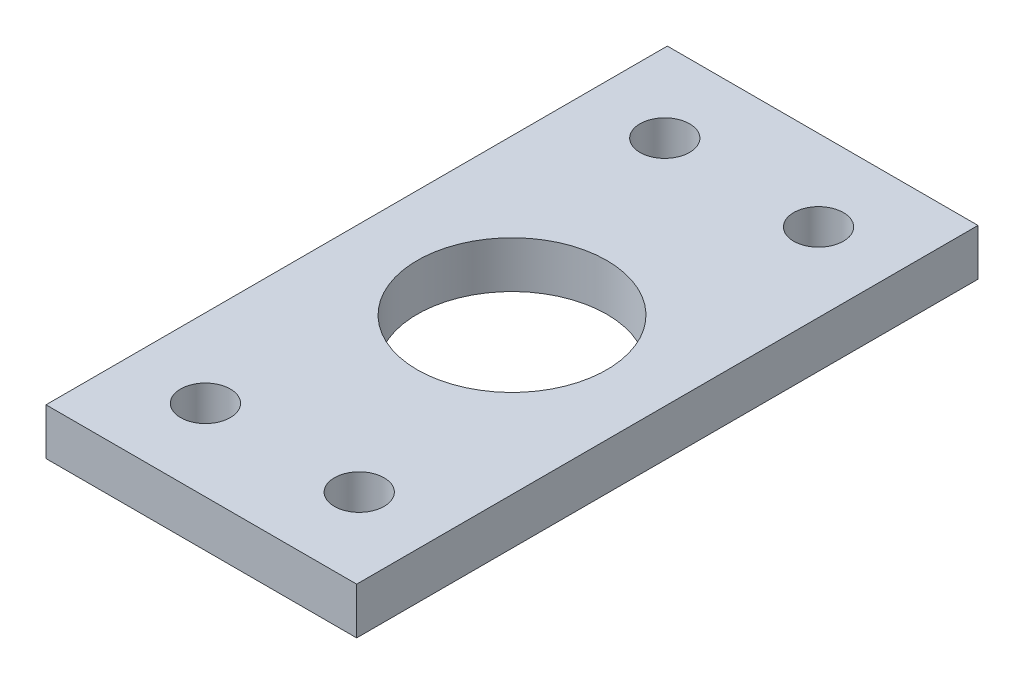
ISO-10303-21;
HEADER;
FILE_DESCRIPTION(('STEP AP214'),'2;1');
FILE_NAME('part.step','',(''),(''),'','','');
FILE_SCHEMA(('AUTOMOTIVE_DESIGN { 1 0 10303 214 1 1 1 1 }'));
ENDSEC;
DATA;
#1=APPLICATION_CONTEXT('core data for automotive mechanical design processes');
#2=APPLICATION_PROTOCOL_DEFINITION('international standard','automotive_design',2000,#1);
#3=PRODUCT_CONTEXT('',#1,'mechanical');
#4=PRODUCT('Part','Part','',(#3));
#5=PRODUCT_RELATED_PRODUCT_CATEGORY('part','',(#4));
#6=PRODUCT_DEFINITION_FORMATION('','',#4);
#7=PRODUCT_DEFINITION_CONTEXT('part definition',#1,'design');
#8=PRODUCT_DEFINITION('design','',#6,#7);
#9=PRODUCT_DEFINITION_SHAPE('','',#8);
#10=(LENGTH_UNIT() NAMED_UNIT(*) SI_UNIT(.MILLI.,.METRE.));
#11=(NAMED_UNIT(*) PLANE_ANGLE_UNIT() SI_UNIT($,.RADIAN.));
#12=(NAMED_UNIT(*) SI_UNIT($,.STERADIAN.) SOLID_ANGLE_UNIT());
#13=UNCERTAINTY_MEASURE_WITH_UNIT(LENGTH_MEASURE(1.E-05),#10,'distance_accuracy_value','');
#14=(GEOMETRIC_REPRESENTATION_CONTEXT(3) GLOBAL_UNCERTAINTY_ASSIGNED_CONTEXT((#13)) GLOBAL_UNIT_ASSIGNED_CONTEXT((#10,
#11,#12)) REPRESENTATION_CONTEXT('',''));
#15=CARTESIAN_POINT('',(0.,0.,0.));
#16=DIRECTION('',(0.,0.,1.));
#17=DIRECTION('',(1.,0.,0.));
#18=AXIS2_PLACEMENT_3D('',#15,#16,#17);
#19=CARTESIAN_POINT('',(0.,3.,0.));
#20=DIRECTION('',(0.,-1.,0.));
#21=DIRECTION('',(0.,0.,-1.));
#22=AXIS2_PLACEMENT_3D('',#19,#20,#21);
#23=PLANE('',#22);
#24=DIRECTION('',(0.,0.,-1.));
#25=VECTOR('',#24,1.);
#26=CARTESIAN_POINT('',(10.,3.,20.));
#27=LINE('',#26,#25);
#28=CARTESIAN_POINT('',(10.,3.,20.));
#29=VERTEX_POINT('',#28);
#30=CARTESIAN_POINT('',(10.,3.,-20.));
#31=VERTEX_POINT('',#30);
#32=EDGE_CURVE('E85',#29,#31,#27,.T.);
#33=ORIENTED_EDGE('',*,*,#32,.T.);
#34=DIRECTION('',(-1.,0.,0.));
#35=VECTOR('',#34,1.);
#36=CARTESIAN_POINT('',(-10.,3.,-20.));
#37=LINE('',#36,#35);
#38=CARTESIAN_POINT('',(-10.,3.,-20.));
#39=VERTEX_POINT('',#38);
#40=EDGE_CURVE('E80',#31,#39,#37,.T.);
#41=ORIENTED_EDGE('',*,*,#40,.T.);
#42=DIRECTION('',(0.,0.,1.));
#43=VECTOR('',#42,1.);
#44=CARTESIAN_POINT('',(-9.99999999999999,3.,20.));
#45=LINE('',#44,#43);
#46=CARTESIAN_POINT('',(-9.99999999999999,3.,20.));
#47=VERTEX_POINT('',#46);
#48=EDGE_CURVE('E83',#39,#47,#45,.T.);
#49=ORIENTED_EDGE('',*,*,#48,.T.);
#50=DIRECTION('',(1.,0.,0.));
#51=VECTOR('',#50,1.);
#52=CARTESIAN_POINT('',(-9.99999999999999,3.,20.));
#53=LINE('',#52,#51);
#54=EDGE_CURVE('E50',#47,#29,#53,.T.);
#55=ORIENTED_EDGE('',*,*,#54,.T.);
#56=EDGE_LOOP('',(#33,#41,#49,#55));
#57=FACE_BOUND('',#56,.T.);
#58=CARTESIAN_POINT('',(0.,3.,0.));
#59=DIRECTION('',(0.,1.,0.));
#60=DIRECTION('',(0.,0.,1.));
#61=AXIS2_PLACEMENT_3D('',#58,#59,#60);
#62=CIRCLE('',#61,6.1);
#63=CARTESIAN_POINT('',(0.,3.,6.1));
#64=VERTEX_POINT('',#63);
#65=EDGE_CURVE('E100',#64,#64,#62,.T.);
#66=ORIENTED_EDGE('',*,*,#65,.F.);
#67=EDGE_LOOP('',(#66));
#68=FACE_BOUND('',#67,.T.);
#69=CARTESIAN_POINT('',(4.95,3.,-14.785));
#70=DIRECTION('',(0.,1.,0.));
#71=DIRECTION('',(0.,0.,1.));
#72=AXIS2_PLACEMENT_3D('',#69,#70,#71);
#73=CIRCLE('',#72,1.6);
#74=CARTESIAN_POINT('',(4.95,3.,-13.185));
#75=VERTEX_POINT('',#74);
#76=EDGE_CURVE('E115',#75,#75,#73,.T.);
#77=ORIENTED_EDGE('',*,*,#76,.F.);
#78=EDGE_LOOP('',(#77));
#79=FACE_BOUND('',#78,.T.);
#80=CARTESIAN_POINT('',(4.95,3.,14.785));
#81=DIRECTION('',(0.,1.,0.));
#82=DIRECTION('',(0.,0.,-1.));
#83=AXIS2_PLACEMENT_3D('',#80,#81,#82);
#84=CIRCLE('',#83,1.6);
#85=CARTESIAN_POINT('',(4.95,3.,13.185));
#86=VERTEX_POINT('',#85);
#87=EDGE_CURVE('E121',#86,#86,#84,.T.);
#88=ORIENTED_EDGE('',*,*,#87,.F.);
#89=EDGE_LOOP('',(#88));
#90=FACE_BOUND('',#89,.T.);
#91=CARTESIAN_POINT('',(-4.95,3.,-14.785));
#92=DIRECTION('',(0.,1.,0.));
#93=DIRECTION('',(0.,0.,-1.));
#94=AXIS2_PLACEMENT_3D('',#91,#92,#93);
#95=CIRCLE('',#94,1.60000000000001);
#96=CARTESIAN_POINT('',(-4.95,3.,-16.385));
#97=VERTEX_POINT('',#96);
#98=EDGE_CURVE('E127',#97,#97,#95,.T.);
#99=ORIENTED_EDGE('',*,*,#98,.F.);
#100=EDGE_LOOP('',(#99));
#101=FACE_BOUND('',#100,.T.);
#102=CARTESIAN_POINT('',(-4.95,3.,14.785));
#103=DIRECTION('',(0.,1.,0.));
#104=DIRECTION('',(0.,0.,1.));
#105=AXIS2_PLACEMENT_3D('',#102,#103,#104);
#106=CIRCLE('',#105,1.60000000000001);
#107=CARTESIAN_POINT('',(-4.95,3.,16.385));
#108=VERTEX_POINT('',#107);
#109=EDGE_CURVE('E133',#108,#108,#106,.T.);
#110=ORIENTED_EDGE('',*,*,#109,.F.);
#111=EDGE_LOOP('',(#110));
#112=FACE_BOUND('',#111,.T.);
#113=ADVANCED_FACE('F33',(#57,#68,#79,#90,#101,#112),#23,.F.);
#114=CARTESIAN_POINT('',(0.,0.,0.));
#115=DIRECTION('',(0.,-1.,0.));
#116=DIRECTION('',(0.,0.,-1.));
#117=AXIS2_PLACEMENT_3D('',#114,#115,#116);
#118=PLANE('',#117);
#119=CARTESIAN_POINT('',(-4.95,0.,-14.785));
#120=DIRECTION('',(0.,1.,0.));
#121=DIRECTION('',(0.,0.,-1.));
#122=AXIS2_PLACEMENT_3D('',#119,#120,#121);
#123=CIRCLE('',#122,1.60000000000001);
#124=CARTESIAN_POINT('',(-4.95,0.,-16.385));
#125=VERTEX_POINT('',#124);
#126=EDGE_CURVE('E130',#125,#125,#123,.T.);
#127=ORIENTED_EDGE('',*,*,#126,.T.);
#128=EDGE_LOOP('',(#127));
#129=FACE_BOUND('',#128,.T.);
#130=CARTESIAN_POINT('',(4.95,0.,-14.785));
#131=DIRECTION('',(0.,1.,0.));
#132=DIRECTION('',(0.,0.,1.));
#133=AXIS2_PLACEMENT_3D('',#130,#131,#132);
#134=CIRCLE('',#133,1.6);
#135=CARTESIAN_POINT('',(4.95,0.,-13.185));
#136=VERTEX_POINT('',#135);
#137=EDGE_CURVE('E118',#136,#136,#134,.T.);
#138=ORIENTED_EDGE('',*,*,#137,.T.);
#139=EDGE_LOOP('',(#138));
#140=FACE_BOUND('',#139,.T.);
#141=DIRECTION('',(0.,0.,-1.));
#142=VECTOR('',#141,1.);
#143=CARTESIAN_POINT('',(10.,0.,20.));
#144=LINE('',#143,#142);
#145=CARTESIAN_POINT('',(10.,0.,20.));
#146=VERTEX_POINT('',#145);
#147=CARTESIAN_POINT('',(10.,0.,-20.));
#148=VERTEX_POINT('',#147);
#149=EDGE_CURVE('E97',#146,#148,#144,.T.);
#150=ORIENTED_EDGE('',*,*,#149,.F.);
#151=DIRECTION('',(1.,0.,0.));
#152=VECTOR('',#151,1.);
#153=CARTESIAN_POINT('',(-9.99999999999999,0.,20.));
#154=LINE('',#153,#152);
#155=CARTESIAN_POINT('',(-9.99999999999999,0.,20.));
#156=VERTEX_POINT('',#155);
#157=EDGE_CURVE('E73',#156,#146,#154,.T.);
#158=ORIENTED_EDGE('',*,*,#157,.F.);
#159=DIRECTION('',(0.,0.,1.));
#160=VECTOR('',#159,1.);
#161=CARTESIAN_POINT('',(-9.99999999999999,0.,20.));
#162=LINE('',#161,#160);
#163=CARTESIAN_POINT('',(-10.,0.,-20.));
#164=VERTEX_POINT('',#163);
#165=EDGE_CURVE('E67',#164,#156,#162,.T.);
#166=ORIENTED_EDGE('',*,*,#165,.F.);
#167=DIRECTION('',(-1.,0.,0.));
#168=VECTOR('',#167,1.);
#169=CARTESIAN_POINT('',(-10.,0.,-20.));
#170=LINE('',#169,#168);
#171=EDGE_CURVE('E89',#148,#164,#170,.T.);
#172=ORIENTED_EDGE('',*,*,#171,.F.);
#173=EDGE_LOOP('',(#150,#158,#166,#172));
#174=FACE_BOUND('',#173,.T.);
#175=CARTESIAN_POINT('',(0.,0.,0.));
#176=DIRECTION('',(0.,1.,0.));
#177=DIRECTION('',(0.,0.,1.));
#178=AXIS2_PLACEMENT_3D('',#175,#176,#177);
#179=CIRCLE('',#178,6.1);
#180=CARTESIAN_POINT('',(0.,0.,6.1));
#181=VERTEX_POINT('',#180);
#182=EDGE_CURVE('E112',#181,#181,#179,.T.);
#183=ORIENTED_EDGE('',*,*,#182,.T.);
#184=EDGE_LOOP('',(#183));
#185=FACE_BOUND('',#184,.T.);
#186=CARTESIAN_POINT('',(4.95,0.,14.785));
#187=DIRECTION('',(0.,1.,0.));
#188=DIRECTION('',(0.,0.,-1.));
#189=AXIS2_PLACEMENT_3D('',#186,#187,#188);
#190=CIRCLE('',#189,1.6);
#191=CARTESIAN_POINT('',(4.95,0.,13.185));
#192=VERTEX_POINT('',#191);
#193=EDGE_CURVE('E124',#192,#192,#190,.T.);
#194=ORIENTED_EDGE('',*,*,#193,.T.);
#195=EDGE_LOOP('',(#194));
#196=FACE_BOUND('',#195,.T.);
#197=CARTESIAN_POINT('',(-4.95,0.,14.785));
#198=DIRECTION('',(0.,1.,0.));
#199=DIRECTION('',(0.,0.,1.));
#200=AXIS2_PLACEMENT_3D('',#197,#198,#199);
#201=CIRCLE('',#200,1.60000000000001);
#202=CARTESIAN_POINT('',(-4.95,0.,16.385));
#203=VERTEX_POINT('',#202);
#204=EDGE_CURVE('E136',#203,#203,#201,.T.);
#205=ORIENTED_EDGE('',*,*,#204,.T.);
#206=EDGE_LOOP('',(#205));
#207=FACE_BOUND('',#206,.T.);
#208=ADVANCED_FACE('F108',(#129,#140,#174,#185,#196,#207),#118,.T.);
#209=CARTESIAN_POINT('',(10.,3.,20.));
#210=DIRECTION('',(-1.,0.,0.));
#211=DIRECTION('',(0.,0.,1.));
#212=AXIS2_PLACEMENT_3D('',#209,#210,#211);
#213=PLANE('',#212);
#214=ORIENTED_EDGE('',*,*,#149,.T.);
#215=DIRECTION('',(0.,-1.,0.));
#216=VECTOR('',#215,1.);
#217=CARTESIAN_POINT('',(10.,3.,-20.));
#218=LINE('',#217,#216);
#219=EDGE_CURVE('E11',#31,#148,#218,.T.);
#220=ORIENTED_EDGE('',*,*,#219,.F.);
#221=ORIENTED_EDGE('',*,*,#32,.F.);
#222=DIRECTION('',(0.,-1.,0.));
#223=VECTOR('',#222,1.);
#224=CARTESIAN_POINT('',(10.,3.,20.));
#225=LINE('',#224,#223);
#226=EDGE_CURVE('E93',#29,#146,#225,.T.);
#227=ORIENTED_EDGE('',*,*,#226,.T.);
#228=EDGE_LOOP('',(#214,#220,#221,#227));
#229=FACE_BOUND('',#228,.T.);
#230=ADVANCED_FACE('F35',(#229),#213,.F.);
#231=CARTESIAN_POINT('',(-10.,3.,-20.));
#232=DIRECTION('',(0.,0.,1.));
#233=DIRECTION('',(1.,0.,0.));
#234=AXIS2_PLACEMENT_3D('',#231,#232,#233);
#235=PLANE('',#234);
#236=ORIENTED_EDGE('',*,*,#171,.T.);
#237=DIRECTION('',(0.,-1.,0.));
#238=VECTOR('',#237,1.);
#239=CARTESIAN_POINT('',(-10.,3.,-20.));
#240=LINE('',#239,#238);
#241=EDGE_CURVE('E42',#39,#164,#240,.T.);
#242=ORIENTED_EDGE('',*,*,#241,.F.);
#243=ORIENTED_EDGE('',*,*,#40,.F.);
#244=ORIENTED_EDGE('',*,*,#219,.T.);
#245=EDGE_LOOP('',(#236,#242,#243,#244));
#246=FACE_BOUND('',#245,.T.);
#247=ADVANCED_FACE('F88',(#246),#235,.F.);
#248=CARTESIAN_POINT('',(-9.99999999999999,3.,20.));
#249=DIRECTION('',(1.,0.,0.));
#250=DIRECTION('',(0.,0.,-1.));
#251=AXIS2_PLACEMENT_3D('',#248,#249,#250);
#252=PLANE('',#251);
#253=ORIENTED_EDGE('',*,*,#165,.T.);
#254=DIRECTION('',(0.,-1.,0.));
#255=VECTOR('',#254,1.);
#256=CARTESIAN_POINT('',(-9.99999999999999,3.,20.));
#257=LINE('',#256,#255);
#258=EDGE_CURVE('E90',#47,#156,#257,.T.);
#259=ORIENTED_EDGE('',*,*,#258,.F.);
#260=ORIENTED_EDGE('',*,*,#48,.F.);
#261=ORIENTED_EDGE('',*,*,#241,.T.);
#262=EDGE_LOOP('',(#253,#259,#260,#261));
#263=FACE_BOUND('',#262,.T.);
#264=ADVANCED_FACE('F91',(#263),#252,.F.);
#265=CARTESIAN_POINT('',(-9.99999999999999,3.,20.));
#266=DIRECTION('',(0.,0.,-1.));
#267=DIRECTION('',(-1.,0.,0.));
#268=AXIS2_PLACEMENT_3D('',#265,#266,#267);
#269=PLANE('',#268);
#270=ORIENTED_EDGE('',*,*,#157,.T.);
#271=ORIENTED_EDGE('',*,*,#226,.F.);
#272=ORIENTED_EDGE('',*,*,#54,.F.);
#273=ORIENTED_EDGE('',*,*,#258,.T.);
#274=EDGE_LOOP('',(#270,#271,#272,#273));
#275=FACE_BOUND('',#274,.T.);
#276=ADVANCED_FACE('F105',(#275),#269,.F.);
#277=CARTESIAN_POINT('',(0.,3.,0.));
#278=DIRECTION('',(0.,-1.,0.));
#279=DIRECTION('',(0.,0.,-1.));
#280=AXIS2_PLACEMENT_3D('',#277,#278,#279);
#281=CYLINDRICAL_SURFACE('',#280,6.1);
#282=ORIENTED_EDGE('',*,*,#65,.T.);
#283=EDGE_LOOP('',(#282));
#284=FACE_BOUND('',#283,.T.);
#285=ORIENTED_EDGE('',*,*,#182,.F.);
#286=EDGE_LOOP('',(#285));
#287=FACE_BOUND('',#286,.T.);
#288=ADVANCED_FACE('F153',(#284,#287),#281,.F.);
#289=CARTESIAN_POINT('',(4.95,3.,-14.785));
#290=DIRECTION('',(0.,-1.,0.));
#291=DIRECTION('',(0.,0.,-1.));
#292=AXIS2_PLACEMENT_3D('',#289,#290,#291);
#293=CYLINDRICAL_SURFACE('',#292,1.6);
#294=ORIENTED_EDGE('',*,*,#76,.T.);
#295=EDGE_LOOP('',(#294));
#296=FACE_BOUND('',#295,.T.);
#297=ORIENTED_EDGE('',*,*,#137,.F.);
#298=EDGE_LOOP('',(#297));
#299=FACE_BOUND('',#298,.T.);
#300=ADVANCED_FACE('F199',(#296,#299),#293,.F.);
#301=CARTESIAN_POINT('',(4.95,3.,14.785));
#302=DIRECTION('',(0.,-1.,0.));
#303=DIRECTION('',(0.,0.,-1.));
#304=AXIS2_PLACEMENT_3D('',#301,#302,#303);
#305=CYLINDRICAL_SURFACE('',#304,1.6);
#306=ORIENTED_EDGE('',*,*,#87,.T.);
#307=EDGE_LOOP('',(#306));
#308=FACE_BOUND('',#307,.T.);
#309=ORIENTED_EDGE('',*,*,#193,.F.);
#310=EDGE_LOOP('',(#309));
#311=FACE_BOUND('',#310,.T.);
#312=ADVANCED_FACE('F207',(#308,#311),#305,.F.);
#313=CARTESIAN_POINT('',(-4.95,3.,-14.785));
#314=DIRECTION('',(0.,-1.,0.));
#315=DIRECTION('',(0.,0.,-1.));
#316=AXIS2_PLACEMENT_3D('',#313,#314,#315);
#317=CYLINDRICAL_SURFACE('',#316,1.60000000000001);
#318=ORIENTED_EDGE('',*,*,#98,.T.);
#319=EDGE_LOOP('',(#318));
#320=FACE_BOUND('',#319,.T.);
#321=ORIENTED_EDGE('',*,*,#126,.F.);
#322=EDGE_LOOP('',(#321));
#323=FACE_BOUND('',#322,.T.);
#324=ADVANCED_FACE('F215',(#320,#323),#317,.F.);
#325=CARTESIAN_POINT('',(-4.95,3.,14.785));
#326=DIRECTION('',(0.,-1.,0.));
#327=DIRECTION('',(0.,0.,-1.));
#328=AXIS2_PLACEMENT_3D('',#325,#326,#327);
#329=CYLINDRICAL_SURFACE('',#328,1.60000000000001);
#330=ORIENTED_EDGE('',*,*,#109,.T.);
#331=EDGE_LOOP('',(#330));
#332=FACE_BOUND('',#331,.T.);
#333=ORIENTED_EDGE('',*,*,#204,.F.);
#334=EDGE_LOOP('',(#333));
#335=FACE_BOUND('',#334,.T.);
#336=ADVANCED_FACE('F142',(#332,#335),#329,.F.);
#337=CLOSED_SHELL('',(#113,#208,#230,#247,#264,#276,#288,#300,#312,#324,#336));
#338=MANIFOLD_SOLID_BREP('B2',#337);
#339=ADVANCED_BREP_SHAPE_REPRESENTATION('',(#18,#338),#14);
#340=SHAPE_DEFINITION_REPRESENTATION(#9,#339);
ENDSEC;
END-ISO-10303-21;
